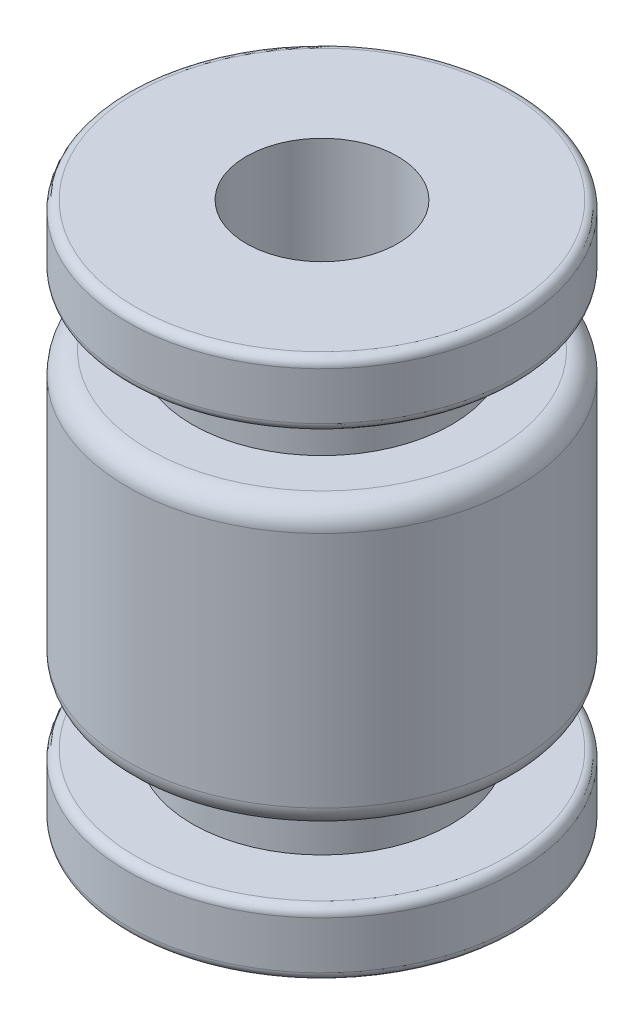
ISO-10303-21;
HEADER;
FILE_DESCRIPTION(('STEP AP214'),'2;1');
FILE_NAME('part.step','',(''),(''),'','','');
FILE_SCHEMA(('AUTOMOTIVE_DESIGN { 1 0 10303 214 1 1 1 1 }'));
ENDSEC;
DATA;
#1=APPLICATION_CONTEXT('core data for automotive mechanical design processes');
#2=APPLICATION_PROTOCOL_DEFINITION('international standard','automotive_design',2000,#1);
#3=PRODUCT_CONTEXT('',#1,'mechanical');
#4=PRODUCT('Part','Part','',(#3));
#5=PRODUCT_RELATED_PRODUCT_CATEGORY('part','',(#4));
#6=PRODUCT_DEFINITION_FORMATION('','',#4);
#7=PRODUCT_DEFINITION_CONTEXT('part definition',#1,'design');
#8=PRODUCT_DEFINITION('design','',#6,#7);
#9=PRODUCT_DEFINITION_SHAPE('','',#8);
#10=(LENGTH_UNIT() NAMED_UNIT(*) SI_UNIT(.MILLI.,.METRE.));
#11=(NAMED_UNIT(*) PLANE_ANGLE_UNIT() SI_UNIT($,.RADIAN.));
#12=(NAMED_UNIT(*) SI_UNIT($,.STERADIAN.) SOLID_ANGLE_UNIT());
#13=UNCERTAINTY_MEASURE_WITH_UNIT(LENGTH_MEASURE(1.E-05),#10,'distance_accuracy_value','');
#14=(GEOMETRIC_REPRESENTATION_CONTEXT(3) GLOBAL_UNCERTAINTY_ASSIGNED_CONTEXT((#13)) GLOBAL_UNIT_ASSIGNED_CONTEXT((#10,
#11,#12)) REPRESENTATION_CONTEXT('',''));
#15=CARTESIAN_POINT('',(0.,0.,0.));
#16=DIRECTION('',(0.,0.,1.));
#17=DIRECTION('',(1.,0.,0.));
#18=AXIS2_PLACEMENT_3D('',#15,#16,#17);
#19=CARTESIAN_POINT('',(1.75,-6.25,0.));
#20=DIRECTION('',(0.,1.,0.));
#21=DIRECTION('',(-1.,0.,0.));
#22=AXIS2_PLACEMENT_3D('',#19,#20,#21);
#23=PLANE('',#22);
#24=CARTESIAN_POINT('',(0.,-6.25,0.));
#25=DIRECTION('',(0.,1.,0.));
#26=DIRECTION('',(-1.,0.,0.));
#27=AXIS2_PLACEMENT_3D('',#24,#25,#26);
#28=CIRCLE('',#27,4.3);
#29=CARTESIAN_POINT('',(-4.3,-6.25,0.));
#30=VERTEX_POINT('',#29);
#31=EDGE_CURVE('E53',#30,#30,#28,.F.);
#32=ORIENTED_EDGE('',*,*,#31,.T.);
#33=EDGE_LOOP('',(#32));
#34=FACE_BOUND('',#33,.T.);
#35=CARTESIAN_POINT('',(0.,-6.25,0.));
#36=DIRECTION('',(0.,1.,0.));
#37=DIRECTION('',(-1.,0.,0.));
#38=AXIS2_PLACEMENT_3D('',#35,#36,#37);
#39=CIRCLE('',#38,1.75);
#40=CARTESIAN_POINT('',(-1.75,-6.25,0.));
#41=VERTEX_POINT('',#40);
#42=EDGE_CURVE('E89',#41,#41,#39,.T.);
#43=ORIENTED_EDGE('',*,*,#42,.T.);
#44=EDGE_LOOP('',(#43));
#45=FACE_BOUND('',#44,.T.);
#46=ADVANCED_FACE('F30',(#34,#45),#23,.F.);
#47=CARTESIAN_POINT('',(0.,6.25,0.));
#48=DIRECTION('',(0.,1.,0.));
#49=DIRECTION('',(-1.,0.,0.));
#50=AXIS2_PLACEMENT_3D('',#47,#48,#49);
#51=CYLINDRICAL_SURFACE('',#50,4.5);
#52=CARTESIAN_POINT('',(0.,-6.05,0.));
#53=DIRECTION('',(0.,1.,0.));
#54=DIRECTION('',(-1.,0.,0.));
#55=AXIS2_PLACEMENT_3D('',#52,#53,#54);
#56=CIRCLE('',#55,4.5);
#57=CARTESIAN_POINT('',(-4.5,-6.05,0.));
#58=VERTEX_POINT('',#57);
#59=EDGE_CURVE('E56',#58,#58,#56,.T.);
#60=ORIENTED_EDGE('',*,*,#59,.T.);
#61=EDGE_LOOP('',(#60));
#62=FACE_BOUND('',#61,.T.);
#63=CARTESIAN_POINT('',(0.,-4.95,0.));
#64=DIRECTION('',(0.,-1.,0.));
#65=DIRECTION('',(1.,0.,0.));
#66=AXIS2_PLACEMENT_3D('',#63,#64,#65);
#67=CIRCLE('',#66,4.5);
#68=CARTESIAN_POINT('',(4.5,-4.95,0.));
#69=VERTEX_POINT('',#68);
#70=EDGE_CURVE('E59',#69,#69,#67,.T.);
#71=ORIENTED_EDGE('',*,*,#70,.T.);
#72=EDGE_LOOP('',(#71));
#73=FACE_BOUND('',#72,.T.);
#74=ADVANCED_FACE('F112',(#62,#73),#51,.T.);
#75=CARTESIAN_POINT('',(4.5,-4.75,0.));
#76=DIRECTION('',(0.,-1.,0.));
#77=DIRECTION('',(1.,0.,0.));
#78=AXIS2_PLACEMENT_3D('',#75,#76,#77);
#79=PLANE('',#78);
#80=CARTESIAN_POINT('',(0.,-4.75,0.));
#81=DIRECTION('',(0.,-1.,0.));
#82=DIRECTION('',(1.,0.,0.));
#83=AXIS2_PLACEMENT_3D('',#80,#81,#82);
#84=CIRCLE('',#83,4.3);
#85=CARTESIAN_POINT('',(4.3,-4.75,0.));
#86=VERTEX_POINT('',#85);
#87=EDGE_CURVE('E50',#86,#86,#84,.F.);
#88=ORIENTED_EDGE('',*,*,#87,.T.);
#89=EDGE_LOOP('',(#88));
#90=FACE_BOUND('',#89,.T.);
#91=CARTESIAN_POINT('',(0.,-4.75,0.));
#92=DIRECTION('',(0.,1.,0.));
#93=DIRECTION('',(-1.,0.,0.));
#94=AXIS2_PLACEMENT_3D('',#91,#92,#93);
#95=CIRCLE('',#94,3.);
#96=CARTESIAN_POINT('',(-3.,-4.75,0.));
#97=VERTEX_POINT('',#96);
#98=EDGE_CURVE('E74',#97,#97,#95,.T.);
#99=ORIENTED_EDGE('',*,*,#98,.F.);
#100=EDGE_LOOP('',(#99));
#101=FACE_BOUND('',#100,.T.);
#102=ADVANCED_FACE('F118',(#90,#101),#79,.F.);
#103=CARTESIAN_POINT('',(0.,6.25,0.));
#104=DIRECTION('',(0.,1.,0.));
#105=DIRECTION('',(-1.,0.,0.));
#106=AXIS2_PLACEMENT_3D('',#103,#104,#105);
#107=CYLINDRICAL_SURFACE('',#106,3.);
#108=CARTESIAN_POINT('',(0.,-3.25,0.));
#109=DIRECTION('',(0.,1.,0.));
#110=DIRECTION('',(-1.,0.,0.));
#111=AXIS2_PLACEMENT_3D('',#108,#109,#110);
#112=CIRCLE('',#111,3.);
#113=CARTESIAN_POINT('',(-3.,-3.25,0.));
#114=VERTEX_POINT('',#113);
#115=EDGE_CURVE('E77',#114,#114,#112,.T.);
#116=ORIENTED_EDGE('',*,*,#115,.F.);
#117=EDGE_LOOP('',(#116));
#118=FACE_BOUND('',#117,.T.);
#119=ORIENTED_EDGE('',*,*,#98,.T.);
#120=EDGE_LOOP('',(#119));
#121=FACE_BOUND('',#120,.T.);
#122=ADVANCED_FACE('F199',(#118,#121),#107,.T.);
#123=CARTESIAN_POINT('',(3.,-3.25,0.));
#124=DIRECTION('',(0.,1.,0.));
#125=DIRECTION('',(-1.,0.,0.));
#126=AXIS2_PLACEMENT_3D('',#123,#124,#125);
#127=PLANE('',#126);
#128=CARTESIAN_POINT('',(0.,-3.25,0.));
#129=DIRECTION('',(0.,1.,0.));
#130=DIRECTION('',(-1.,0.,0.));
#131=AXIS2_PLACEMENT_3D('',#128,#129,#130);
#132=CIRCLE('',#131,4.);
#133=CARTESIAN_POINT('',(-4.,-3.25,0.));
#134=VERTEX_POINT('',#133);
#135=EDGE_CURVE('E65',#134,#134,#132,.F.);
#136=ORIENTED_EDGE('',*,*,#135,.T.);
#137=EDGE_LOOP('',(#136));
#138=FACE_BOUND('',#137,.T.);
#139=ORIENTED_EDGE('',*,*,#115,.T.);
#140=EDGE_LOOP('',(#139));
#141=FACE_BOUND('',#140,.T.);
#142=ADVANCED_FACE('F242',(#138,#141),#127,.F.);
#143=CARTESIAN_POINT('',(0.,6.25,0.));
#144=DIRECTION('',(0.,1.,0.));
#145=DIRECTION('',(-1.,0.,0.));
#146=AXIS2_PLACEMENT_3D('',#143,#144,#145);
#147=CYLINDRICAL_SURFACE('',#146,4.5);
#148=CARTESIAN_POINT('',(0.,-2.75,0.));
#149=DIRECTION('',(0.,1.,0.));
#150=DIRECTION('',(-1.,0.,0.));
#151=AXIS2_PLACEMENT_3D('',#148,#149,#150);
#152=CIRCLE('',#151,4.5);
#153=CARTESIAN_POINT('',(-4.5,-2.75,0.));
#154=VERTEX_POINT('',#153);
#155=EDGE_CURVE('E68',#154,#154,#152,.T.);
#156=ORIENTED_EDGE('',*,*,#155,.T.);
#157=EDGE_LOOP('',(#156));
#158=FACE_BOUND('',#157,.T.);
#159=CARTESIAN_POINT('',(0.,2.75,0.));
#160=DIRECTION('',(0.,-1.,0.));
#161=DIRECTION('',(1.,0.,0.));
#162=AXIS2_PLACEMENT_3D('',#159,#160,#161);
#163=CIRCLE('',#162,4.5);
#164=CARTESIAN_POINT('',(4.5,2.75,0.));
#165=VERTEX_POINT('',#164);
#166=EDGE_CURVE('E71',#165,#165,#163,.T.);
#167=ORIENTED_EDGE('',*,*,#166,.T.);
#168=EDGE_LOOP('',(#167));
#169=FACE_BOUND('',#168,.T.);
#170=ADVANCED_FACE('F232',(#158,#169),#147,.T.);
#171=CARTESIAN_POINT('',(4.5,3.25,0.));
#172=DIRECTION('',(0.,-1.,0.));
#173=DIRECTION('',(1.,0.,0.));
#174=AXIS2_PLACEMENT_3D('',#171,#172,#173);
#175=PLANE('',#174);
#176=CARTESIAN_POINT('',(0.,3.25,0.));
#177=DIRECTION('',(0.,-1.,0.));
#178=DIRECTION('',(1.,0.,0.));
#179=AXIS2_PLACEMENT_3D('',#176,#177,#178);
#180=CIRCLE('',#179,4.);
#181=CARTESIAN_POINT('',(4.,3.25,0.));
#182=VERTEX_POINT('',#181);
#183=EDGE_CURVE('E62',#182,#182,#180,.F.);
#184=ORIENTED_EDGE('',*,*,#183,.T.);
#185=EDGE_LOOP('',(#184));
#186=FACE_BOUND('',#185,.T.);
#187=CARTESIAN_POINT('',(0.,3.25,0.));
#188=DIRECTION('',(0.,1.,0.));
#189=DIRECTION('',(-1.,0.,0.));
#190=AXIS2_PLACEMENT_3D('',#187,#188,#189);
#191=CIRCLE('',#190,3.);
#192=CARTESIAN_POINT('',(-3.,3.25,0.));
#193=VERTEX_POINT('',#192);
#194=EDGE_CURVE('E80',#193,#193,#191,.T.);
#195=ORIENTED_EDGE('',*,*,#194,.F.);
#196=EDGE_LOOP('',(#195));
#197=FACE_BOUND('',#196,.T.);
#198=ADVANCED_FACE('F227',(#186,#197),#175,.F.);
#199=CARTESIAN_POINT('',(0.,6.25,0.));
#200=DIRECTION('',(0.,1.,0.));
#201=DIRECTION('',(-1.,0.,0.));
#202=AXIS2_PLACEMENT_3D('',#199,#200,#201);
#203=CYLINDRICAL_SURFACE('',#202,3.);
#204=CARTESIAN_POINT('',(0.,4.75,0.));
#205=DIRECTION('',(0.,1.,0.));
#206=DIRECTION('',(-1.,0.,0.));
#207=AXIS2_PLACEMENT_3D('',#204,#205,#206);
#208=CIRCLE('',#207,3.);
#209=CARTESIAN_POINT('',(-3.,4.75,0.));
#210=VERTEX_POINT('',#209);
#211=EDGE_CURVE('E83',#210,#210,#208,.T.);
#212=ORIENTED_EDGE('',*,*,#211,.F.);
#213=EDGE_LOOP('',(#212));
#214=FACE_BOUND('',#213,.T.);
#215=ORIENTED_EDGE('',*,*,#194,.T.);
#216=EDGE_LOOP('',(#215));
#217=FACE_BOUND('',#216,.T.);
#218=ADVANCED_FACE('F188',(#214,#217),#203,.T.);
#219=CARTESIAN_POINT('',(3.,4.75,0.));
#220=DIRECTION('',(0.,1.,0.));
#221=DIRECTION('',(-1.,0.,0.));
#222=AXIS2_PLACEMENT_3D('',#219,#220,#221);
#223=PLANE('',#222);
#224=CARTESIAN_POINT('',(0.,4.75,0.));
#225=DIRECTION('',(0.,1.,0.));
#226=DIRECTION('',(-1.,0.,0.));
#227=AXIS2_PLACEMENT_3D('',#224,#225,#226);
#228=CIRCLE('',#227,4.3);
#229=CARTESIAN_POINT('',(-4.3,4.75,0.));
#230=VERTEX_POINT('',#229);
#231=EDGE_CURVE('E37',#230,#230,#228,.F.);
#232=ORIENTED_EDGE('',*,*,#231,.T.);
#233=EDGE_LOOP('',(#232));
#234=FACE_BOUND('',#233,.T.);
#235=ORIENTED_EDGE('',*,*,#211,.T.);
#236=EDGE_LOOP('',(#235));
#237=FACE_BOUND('',#236,.T.);
#238=ADVANCED_FACE('F108',(#234,#237),#223,.F.);
#239=CARTESIAN_POINT('',(0.,6.25,0.));
#240=DIRECTION('',(0.,1.,0.));
#241=DIRECTION('',(-1.,0.,0.));
#242=AXIS2_PLACEMENT_3D('',#239,#240,#241);
#243=CYLINDRICAL_SURFACE('',#242,4.5);
#244=CARTESIAN_POINT('',(0.,4.95,0.));
#245=DIRECTION('',(0.,1.,0.));
#246=DIRECTION('',(-1.,0.,0.));
#247=AXIS2_PLACEMENT_3D('',#244,#245,#246);
#248=CIRCLE('',#247,4.5);
#249=CARTESIAN_POINT('',(-4.5,4.95,0.));
#250=VERTEX_POINT('',#249);
#251=EDGE_CURVE('E41',#250,#250,#248,.T.);
#252=ORIENTED_EDGE('',*,*,#251,.T.);
#253=EDGE_LOOP('',(#252));
#254=FACE_BOUND('',#253,.T.);
#255=CARTESIAN_POINT('',(0.,6.05,0.));
#256=DIRECTION('',(0.,-1.,0.));
#257=DIRECTION('',(1.,0.,0.));
#258=AXIS2_PLACEMENT_3D('',#255,#256,#257);
#259=CIRCLE('',#258,4.5);
#260=CARTESIAN_POINT('',(4.5,6.05,0.));
#261=VERTEX_POINT('',#260);
#262=EDGE_CURVE('E45',#261,#261,#259,.T.);
#263=ORIENTED_EDGE('',*,*,#262,.T.);
#264=EDGE_LOOP('',(#263));
#265=FACE_BOUND('',#264,.T.);
#266=ADVANCED_FACE('F103',(#254,#265),#243,.T.);
#267=CARTESIAN_POINT('',(4.5,6.25,0.));
#268=DIRECTION('',(0.,-1.,0.));
#269=DIRECTION('',(1.,0.,0.));
#270=AXIS2_PLACEMENT_3D('',#267,#268,#269);
#271=PLANE('',#270);
#272=CARTESIAN_POINT('',(0.,6.25,0.));
#273=DIRECTION('',(0.,-1.,0.));
#274=DIRECTION('',(1.,0.,0.));
#275=AXIS2_PLACEMENT_3D('',#272,#273,#274);
#276=CIRCLE('',#275,4.3);
#277=CARTESIAN_POINT('',(4.3,6.25,0.));
#278=VERTEX_POINT('',#277);
#279=EDGE_CURVE('E10',#278,#278,#276,.F.);
#280=ORIENTED_EDGE('',*,*,#279,.T.);
#281=EDGE_LOOP('',(#280));
#282=FACE_BOUND('',#281,.T.);
#283=CARTESIAN_POINT('',(0.,6.25,0.));
#284=DIRECTION('',(0.,1.,0.));
#285=DIRECTION('',(-1.,0.,0.));
#286=AXIS2_PLACEMENT_3D('',#283,#284,#285);
#287=CIRCLE('',#286,1.75);
#288=CARTESIAN_POINT('',(-1.75000000000001,6.25,0.));
#289=VERTEX_POINT('',#288);
#290=EDGE_CURVE('E86',#289,#289,#287,.T.);
#291=ORIENTED_EDGE('',*,*,#290,.F.);
#292=EDGE_LOOP('',(#291));
#293=FACE_BOUND('',#292,.T.);
#294=ADVANCED_FACE('F98',(#282,#293),#271,.F.);
#295=CARTESIAN_POINT('',(0.,6.25,0.));
#296=DIRECTION('',(0.,1.,0.));
#297=DIRECTION('',(-1.,0.,0.));
#298=AXIS2_PLACEMENT_3D('',#295,#296,#297);
#299=CYLINDRICAL_SURFACE('',#298,1.75);
#300=ORIENTED_EDGE('',*,*,#42,.F.);
#301=EDGE_LOOP('',(#300));
#302=FACE_BOUND('',#301,.T.);
#303=ORIENTED_EDGE('',*,*,#290,.T.);
#304=EDGE_LOOP('',(#303));
#305=FACE_BOUND('',#304,.T.);
#306=ADVANCED_FACE('F94',(#302,#305),#299,.F.);
#307=CARTESIAN_POINT('',(0.,-2.75,0.));
#308=DIRECTION('',(0.,1.,0.));
#309=DIRECTION('',(-1.,0.,0.));
#310=AXIS2_PLACEMENT_3D('',#307,#308,#309);
#311=TOROIDAL_SURFACE('',#310,4.,0.5);
#312=ORIENTED_EDGE('',*,*,#135,.F.);
#313=EDGE_LOOP('',(#312));
#314=FACE_BOUND('',#313,.T.);
#315=ORIENTED_EDGE('',*,*,#155,.F.);
#316=EDGE_LOOP('',(#315));
#317=FACE_BOUND('',#316,.T.);
#318=ADVANCED_FACE('F97',(#314,#317),#311,.T.);
#319=CARTESIAN_POINT('',(0.,2.75,0.));
#320=DIRECTION('',(0.,-1.,0.));
#321=DIRECTION('',(1.,0.,0.));
#322=AXIS2_PLACEMENT_3D('',#319,#320,#321);
#323=TOROIDAL_SURFACE('',#322,4.,0.5);
#324=ORIENTED_EDGE('',*,*,#166,.F.);
#325=EDGE_LOOP('',(#324));
#326=FACE_BOUND('',#325,.T.);
#327=ORIENTED_EDGE('',*,*,#183,.F.);
#328=EDGE_LOOP('',(#327));
#329=FACE_BOUND('',#328,.T.);
#330=ADVANCED_FACE('F125',(#326,#329),#323,.T.);
#331=CARTESIAN_POINT('',(0.,-6.05,0.));
#332=DIRECTION('',(0.,1.,0.));
#333=DIRECTION('',(-1.,0.,0.));
#334=AXIS2_PLACEMENT_3D('',#331,#332,#333);
#335=TOROIDAL_SURFACE('',#334,4.3,0.2);
#336=ORIENTED_EDGE('',*,*,#31,.F.);
#337=EDGE_LOOP('',(#336));
#338=FACE_BOUND('',#337,.T.);
#339=ORIENTED_EDGE('',*,*,#59,.F.);
#340=EDGE_LOOP('',(#339));
#341=FACE_BOUND('',#340,.T.);
#342=ADVANCED_FACE('F129',(#338,#341),#335,.T.);
#343=CARTESIAN_POINT('',(0.,-4.95,0.));
#344=DIRECTION('',(0.,-1.,0.));
#345=DIRECTION('',(1.,0.,0.));
#346=AXIS2_PLACEMENT_3D('',#343,#344,#345);
#347=TOROIDAL_SURFACE('',#346,4.3,0.2);
#348=ORIENTED_EDGE('',*,*,#70,.F.);
#349=EDGE_LOOP('',(#348));
#350=FACE_BOUND('',#349,.T.);
#351=ORIENTED_EDGE('',*,*,#87,.F.);
#352=EDGE_LOOP('',(#351));
#353=FACE_BOUND('',#352,.T.);
#354=ADVANCED_FACE('F133',(#350,#353),#347,.T.);
#355=CARTESIAN_POINT('',(0.,4.95,0.));
#356=DIRECTION('',(0.,1.,0.));
#357=DIRECTION('',(-1.,0.,0.));
#358=AXIS2_PLACEMENT_3D('',#355,#356,#357);
#359=TOROIDAL_SURFACE('',#358,4.3,0.2);
#360=ORIENTED_EDGE('',*,*,#231,.F.);
#361=EDGE_LOOP('',(#360));
#362=FACE_BOUND('',#361,.T.);
#363=ORIENTED_EDGE('',*,*,#251,.F.);
#364=EDGE_LOOP('',(#363));
#365=FACE_BOUND('',#364,.T.);
#366=ADVANCED_FACE('F136',(#362,#365),#359,.T.);
#367=CARTESIAN_POINT('',(0.,6.05,0.));
#368=DIRECTION('',(0.,-1.,0.));
#369=DIRECTION('',(1.,0.,0.));
#370=AXIS2_PLACEMENT_3D('',#367,#368,#369);
#371=TOROIDAL_SURFACE('',#370,4.3,0.2);
#372=ORIENTED_EDGE('',*,*,#262,.F.);
#373=EDGE_LOOP('',(#372));
#374=FACE_BOUND('',#373,.T.);
#375=ORIENTED_EDGE('',*,*,#279,.F.);
#376=EDGE_LOOP('',(#375));
#377=FACE_BOUND('',#376,.T.);
#378=ADVANCED_FACE('F32',(#374,#377),#371,.T.);
#379=CLOSED_SHELL('',(#46,#74,#102,#122,#142,#170,#198,#218,#238,#266,#294,#306,#318,#330,#342,
#354,#366,#378));
#380=MANIFOLD_SOLID_BREP('B2',#379);
#381=ADVANCED_BREP_SHAPE_REPRESENTATION('',(#18,#380),#14);
#382=SHAPE_DEFINITION_REPRESENTATION(#9,#381);
ENDSEC;
END-ISO-10303-21;
